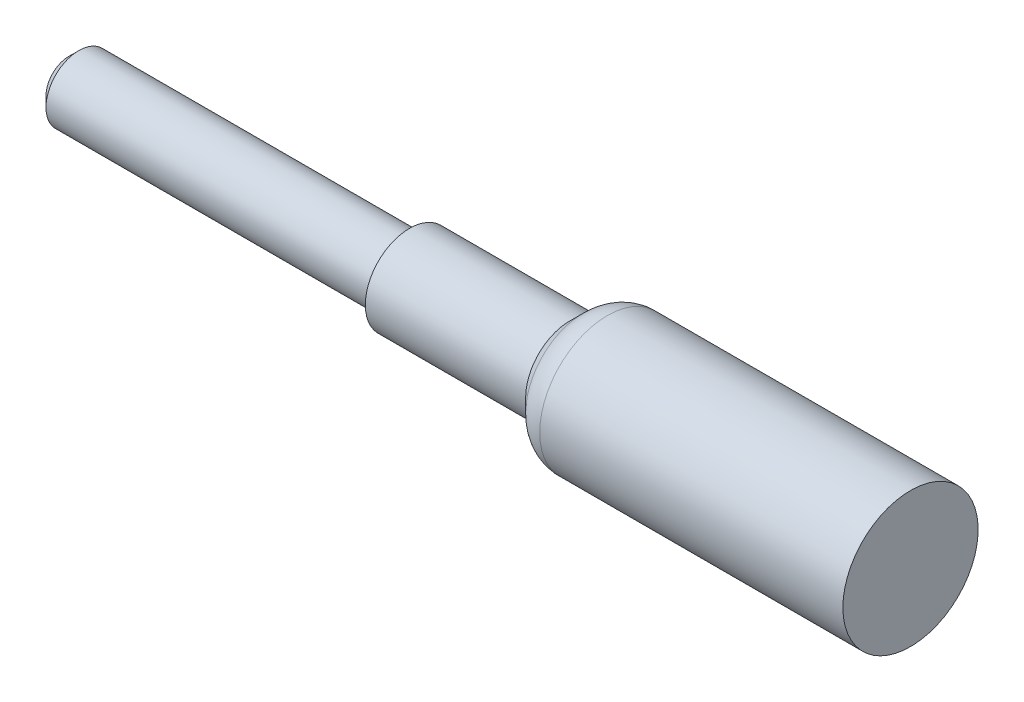
ISO-10303-21;
HEADER;
FILE_DESCRIPTION(('STEP AP214'),'2;1');
FILE_NAME('part.step','',(''),(''),'','','');
FILE_SCHEMA(('AUTOMOTIVE_DESIGN { 1 0 10303 214 1 1 1 1 }'));
ENDSEC;
DATA;
#1=APPLICATION_CONTEXT('core data for automotive mechanical design processes');
#2=APPLICATION_PROTOCOL_DEFINITION('international standard','automotive_design',2000,#1);
#3=PRODUCT_CONTEXT('',#1,'mechanical');
#4=PRODUCT('Part','Part','',(#3));
#5=PRODUCT_RELATED_PRODUCT_CATEGORY('part','',(#4));
#6=PRODUCT_DEFINITION_FORMATION('','',#4);
#7=PRODUCT_DEFINITION_CONTEXT('part definition',#1,'design');
#8=PRODUCT_DEFINITION('design','',#6,#7);
#9=PRODUCT_DEFINITION_SHAPE('','',#8);
#10=(LENGTH_UNIT() NAMED_UNIT(*) SI_UNIT(.MILLI.,.METRE.));
#11=(NAMED_UNIT(*) PLANE_ANGLE_UNIT() SI_UNIT($,.RADIAN.));
#12=(NAMED_UNIT(*) SI_UNIT($,.STERADIAN.) SOLID_ANGLE_UNIT());
#13=UNCERTAINTY_MEASURE_WITH_UNIT(LENGTH_MEASURE(1.E-05),#10,'distance_accuracy_value','');
#14=(GEOMETRIC_REPRESENTATION_CONTEXT(3) GLOBAL_UNCERTAINTY_ASSIGNED_CONTEXT((#13)) GLOBAL_UNIT_ASSIGNED_CONTEXT((#10,
#11,#12)) REPRESENTATION_CONTEXT('',''));
#15=CARTESIAN_POINT('',(0.,0.,0.));
#16=DIRECTION('',(0.,0.,1.));
#17=DIRECTION('',(1.,0.,0.));
#18=AXIS2_PLACEMENT_3D('',#15,#16,#17);
#19=CARTESIAN_POINT('',(31.75,0.,0.));
#20=DIRECTION('',(-1.,0.,0.));
#21=DIRECTION('',(0.,0.,1.));
#22=AXIS2_PLACEMENT_3D('',#19,#20,#21);
#23=PLANE('',#22);
#24=CARTESIAN_POINT('',(31.75,0.,0.));
#25=DIRECTION('',(-1.,0.,0.));
#26=DIRECTION('',(0.,0.,1.));
#27=AXIS2_PLACEMENT_3D('',#24,#25,#26);
#28=CIRCLE('',#27,4.28625);
#29=CARTESIAN_POINT('',(31.75,0.,4.28625));
#30=VERTEX_POINT('',#29);
#31=EDGE_CURVE('E59',#30,#30,#28,.T.);
#32=ORIENTED_EDGE('',*,*,#31,.F.);
#33=EDGE_LOOP('',(#32));
#34=FACE_BOUND('',#33,.T.);
#35=ADVANCED_FACE('F35',(#34),#23,.F.);
#36=CARTESIAN_POINT('',(0.,0.,0.));
#37=DIRECTION('',(-1.,0.,0.));
#38=DIRECTION('',(0.,0.,1.));
#39=AXIS2_PLACEMENT_3D('',#36,#37,#38);
#40=CYLINDRICAL_SURFACE('',#39,4.28625);
#41=CARTESIAN_POINT('',(12.5405370811635,0.,0.));
#42=DIRECTION('',(1.,0.,0.));
#43=DIRECTION('',(0.,0.,-1.));
#44=AXIS2_PLACEMENT_3D('',#41,#42,#43);
#45=CIRCLE('',#44,4.28625);
#46=CARTESIAN_POINT('',(12.5405370811635,0.,-4.28625));
#47=VERTEX_POINT('',#46);
#48=EDGE_CURVE('E51',#47,#47,#45,.T.);
#49=ORIENTED_EDGE('',*,*,#48,.T.);
#50=EDGE_LOOP('',(#49));
#51=FACE_BOUND('',#50,.T.);
#52=ORIENTED_EDGE('',*,*,#31,.T.);
#53=EDGE_LOOP('',(#52));
#54=FACE_BOUND('',#53,.T.);
#55=ADVANCED_FACE('F79',(#51,#54),#40,.T.);
#56=CARTESIAN_POINT('',(11.64625,0.,0.));
#57=DIRECTION('',(1.,0.,0.));
#58=DIRECTION('',(0.,0.,-1.));
#59=AXIS2_PLACEMENT_3D('',#56,#57,#58);
#60=CONICAL_SURFACE('',#59,4.28625,0.78539816339745);
#61=CARTESIAN_POINT('',(11.0138935405817,0.,0.));
#62=DIRECTION('',(-1.,0.,0.));
#63=DIRECTION('',(0.,0.,1.));
#64=AXIS2_PLACEMENT_3D('',#61,#62,#63);
#65=CIRCLE('',#64,3.65389354058175);
#66=CARTESIAN_POINT('',(11.0138935405817,0.,3.65389354058175));
#67=VERTEX_POINT('',#66);
#68=EDGE_CURVE('E56',#67,#67,#65,.T.);
#69=ORIENTED_EDGE('',*,*,#68,.T.);
#70=EDGE_LOOP('',(#69));
#71=FACE_BOUND('',#70,.T.);
#72=CARTESIAN_POINT('',(10.16,0.,0.));
#73=DIRECTION('',(-1.,0.,0.));
#74=DIRECTION('',(0.,0.,1.));
#75=AXIS2_PLACEMENT_3D('',#72,#73,#74);
#76=CIRCLE('',#75,2.8);
#77=CARTESIAN_POINT('',(10.16,0.,2.8));
#78=VERTEX_POINT('',#77);
#79=EDGE_CURVE('E62',#78,#78,#76,.T.);
#80=ORIENTED_EDGE('',*,*,#79,.F.);
#81=EDGE_LOOP('',(#80));
#82=FACE_BOUND('',#81,.T.);
#83=ADVANCED_FACE('F74',(#71,#82),#60,.T.);
#84=CARTESIAN_POINT('',(0.,0.,0.));
#85=DIRECTION('',(-1.,0.,0.));
#86=DIRECTION('',(0.,0.,1.));
#87=AXIS2_PLACEMENT_3D('',#84,#85,#86);
#88=CYLINDRICAL_SURFACE('',#87,2.8);
#89=CARTESIAN_POINT('',(0.,0.,0.));
#90=DIRECTION('',(-1.,0.,0.));
#91=DIRECTION('',(0.,0.,1.));
#92=AXIS2_PLACEMENT_3D('',#89,#90,#91);
#93=CIRCLE('',#92,2.8);
#94=CARTESIAN_POINT('',(0.,0.,2.8));
#95=VERTEX_POINT('',#94);
#96=EDGE_CURVE('E65',#95,#95,#93,.T.);
#97=ORIENTED_EDGE('',*,*,#96,.F.);
#98=EDGE_LOOP('',(#97));
#99=FACE_BOUND('',#98,.T.);
#100=ORIENTED_EDGE('',*,*,#79,.T.);
#101=EDGE_LOOP('',(#100));
#102=FACE_BOUND('',#101,.T.);
#103=ADVANCED_FACE('F71',(#99,#102),#88,.T.);
#104=CARTESIAN_POINT('',(0.,2.8,0.));
#105=DIRECTION('',(1.,0.,0.));
#106=DIRECTION('',(0.,0.,-1.));
#107=AXIS2_PLACEMENT_3D('',#104,#105,#106);
#108=PLANE('',#107);
#109=CARTESIAN_POINT('',(0.,0.,0.));
#110=DIRECTION('',(-1.,0.,0.));
#111=DIRECTION('',(0.,0.,1.));
#112=AXIS2_PLACEMENT_3D('',#109,#110,#111);
#113=CIRCLE('',#112,2.0828);
#114=CARTESIAN_POINT('',(0.,0.,2.0828));
#115=VERTEX_POINT('',#114);
#116=EDGE_CURVE('E47',#115,#115,#113,.T.);
#117=ORIENTED_EDGE('',*,*,#116,.F.);
#118=EDGE_LOOP('',(#117));
#119=FACE_BOUND('',#118,.T.);
#120=ORIENTED_EDGE('',*,*,#96,.T.);
#121=EDGE_LOOP('',(#120));
#122=FACE_BOUND('',#121,.T.);
#123=ADVANCED_FACE('F69',(#119,#122),#108,.F.);
#124=CARTESIAN_POINT('',(12.5405370811635,0.,0.));
#125=DIRECTION('',(1.,0.,0.));
#126=DIRECTION('',(0.,0.,-1.));
#127=AXIS2_PLACEMENT_3D('',#124,#125,#126);
#128=DEGENERATE_TOROIDAL_SURFACE('',#127,2.12725,2.159,.T.);
#129=ORIENTED_EDGE('',*,*,#48,.F.);
#130=EDGE_LOOP('',(#129));
#131=FACE_BOUND('',#130,.T.);
#132=ORIENTED_EDGE('',*,*,#68,.F.);
#133=EDGE_LOOP('',(#132));
#134=FACE_BOUND('',#133,.T.);
#135=ADVANCED_FACE('F93',(#131,#134),#128,.T.);
#136=CARTESIAN_POINT('',(-21.59,0.,0.));
#137=DIRECTION('',(1.,0.,0.));
#138=DIRECTION('',(0.,0.,-1.));
#139=AXIS2_PLACEMENT_3D('',#136,#137,#138);
#140=CYLINDRICAL_SURFACE('',#139,2.0828);
#141=CARTESIAN_POINT('',(-20.955,0.,0.));
#142=DIRECTION('',(-1.,0.,0.));
#143=DIRECTION('',(0.,0.,1.));
#144=AXIS2_PLACEMENT_3D('',#141,#142,#143);
#145=CIRCLE('',#144,2.0828);
#146=CARTESIAN_POINT('',(-20.955,0.,2.0828));
#147=VERTEX_POINT('',#146);
#148=EDGE_CURVE('E10',#147,#147,#145,.F.);
#149=ORIENTED_EDGE('',*,*,#148,.T.);
#150=EDGE_LOOP('',(#149));
#151=FACE_BOUND('',#150,.T.);
#152=ORIENTED_EDGE('',*,*,#116,.T.);
#153=EDGE_LOOP('',(#152));
#154=FACE_BOUND('',#153,.T.);
#155=ADVANCED_FACE('F95',(#151,#154),#140,.T.);
#156=CARTESIAN_POINT('',(-21.59,0.,0.));
#157=DIRECTION('',(-1.,0.,0.));
#158=DIRECTION('',(0.,0.,1.));
#159=AXIS2_PLACEMENT_3D('',#156,#157,#158);
#160=PLANE('',#159);
#161=CARTESIAN_POINT('',(-21.59,0.,0.));
#162=DIRECTION('',(-1.,0.,0.));
#163=DIRECTION('',(0.,0.,1.));
#164=AXIS2_PLACEMENT_3D('',#161,#162,#163);
#165=CIRCLE('',#164,1.44780000000001);
#166=CARTESIAN_POINT('',(-21.59,0.,1.44780000000001));
#167=VERTEX_POINT('',#166);
#168=EDGE_CURVE('E43',#167,#167,#165,.T.);
#169=ORIENTED_EDGE('',*,*,#168,.T.);
#170=EDGE_LOOP('',(#169));
#171=FACE_BOUND('',#170,.T.);
#172=ADVANCED_FACE('F101',(#171),#160,.T.);
#173=CARTESIAN_POINT('',(-21.59,0.,0.));
#174=DIRECTION('',(1.,0.,0.));
#175=DIRECTION('',(0.,0.,-1.));
#176=AXIS2_PLACEMENT_3D('',#173,#174,#175);
#177=CONICAL_SURFACE('',#176,1.44780000000001,0.785398163397449);
#178=ORIENTED_EDGE('',*,*,#148,.F.);
#179=EDGE_LOOP('',(#178));
#180=FACE_BOUND('',#179,.T.);
#181=ORIENTED_EDGE('',*,*,#168,.F.);
#182=EDGE_LOOP('',(#181));
#183=FACE_BOUND('',#182,.T.);
#184=ADVANCED_FACE('F38',(#180,#183),#177,.T.);
#185=CLOSED_SHELL('',(#35,#55,#83,#103,#123,#135,#155,#172,#184));
#186=MANIFOLD_SOLID_BREP('B2',#185);
#187=ADVANCED_BREP_SHAPE_REPRESENTATION('',(#18,#186),#14);
#188=SHAPE_DEFINITION_REPRESENTATION(#9,#187);
ENDSEC;
END-ISO-10303-21;
